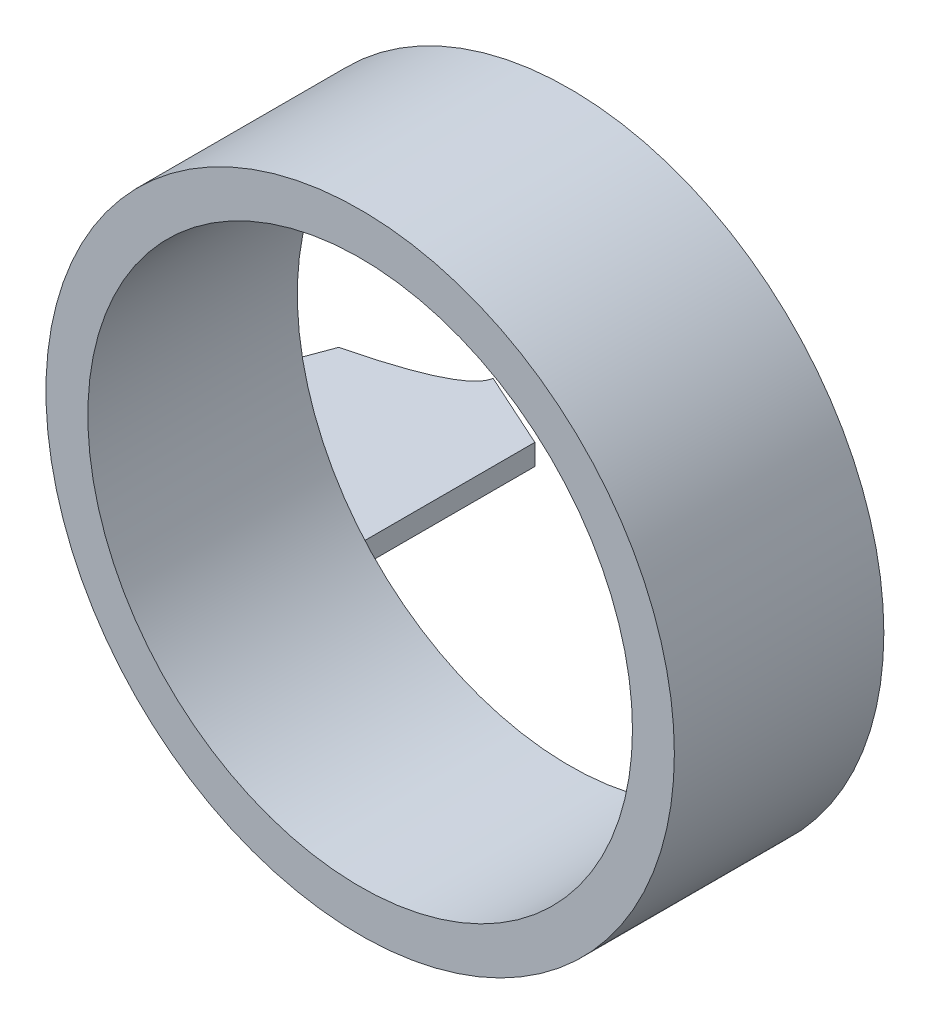
ISO-10303-21;
HEADER;
FILE_DESCRIPTION(('STEP AP214'),'2;1');
FILE_NAME('part.step','',(''),(''),'','','');
FILE_SCHEMA(('AUTOMOTIVE_DESIGN { 1 0 10303 214 1 1 1 1 }'));
ENDSEC;
DATA;
#1=APPLICATION_CONTEXT('core data for automotive mechanical design processes');
#2=APPLICATION_PROTOCOL_DEFINITION('international standard','automotive_design',2000,#1);
#3=PRODUCT_CONTEXT('',#1,'mechanical');
#4=PRODUCT('Part','Part','',(#3));
#5=PRODUCT_RELATED_PRODUCT_CATEGORY('part','',(#4));
#6=PRODUCT_DEFINITION_FORMATION('','',#4);
#7=PRODUCT_DEFINITION_CONTEXT('part definition',#1,'design');
#8=PRODUCT_DEFINITION('design','',#6,#7);
#9=PRODUCT_DEFINITION_SHAPE('','',#8);
#10=(LENGTH_UNIT() NAMED_UNIT(*) SI_UNIT(.MILLI.,.METRE.));
#11=(NAMED_UNIT(*) PLANE_ANGLE_UNIT() SI_UNIT($,.RADIAN.));
#12=(NAMED_UNIT(*) SI_UNIT($,.STERADIAN.) SOLID_ANGLE_UNIT());
#13=UNCERTAINTY_MEASURE_WITH_UNIT(LENGTH_MEASURE(1.E-05),#10,'distance_accuracy_value','');
#14=(GEOMETRIC_REPRESENTATION_CONTEXT(3) GLOBAL_UNCERTAINTY_ASSIGNED_CONTEXT((#13)) GLOBAL_UNIT_ASSIGNED_CONTEXT((#10,
#11,#12)) REPRESENTATION_CONTEXT('',''));
#15=CARTESIAN_POINT('',(0.,0.,0.));
#16=DIRECTION('',(0.,0.,1.));
#17=DIRECTION('',(1.,0.,0.));
#18=AXIS2_PLACEMENT_3D('',#15,#16,#17);
#19=CARTESIAN_POINT('',(-42.4105643599633,-22.,-20.0891984813201));
#20=DIRECTION('',(-0.937499999999993,0.,0.347985272676896));
#21=DIRECTION('',(0.347985272676896,0.,0.937499999999993));
#22=AXIS2_PLACEMENT_3D('',#19,#20,#21);
#23=PLANE('',#22);
#24=DIRECTION('',(0.347985272676896,0.,0.937499999999993));
#25=VECTOR('',#24,1.);
#26=CARTESIAN_POINT('',(-42.4105643599633,-20.,-20.0891984813201));
#27=LINE('',#26,#25);
#28=CARTESIAN_POINT('',(-42.4105643599633,-20.,-20.0891984813201));
#29=VERTEX_POINT('',#28);
#30=CARTESIAN_POINT('',(-39.6266821785482,-20.,-12.5891984813201));
#31=VERTEX_POINT('',#30);
#32=EDGE_CURVE('E193',#29,#31,#27,.T.);
#33=ORIENTED_EDGE('',*,*,#32,.F.);
#34=DIRECTION('',(0.,1.,0.));
#35=VECTOR('',#34,1.);
#36=CARTESIAN_POINT('',(-42.4105643599633,-22.,-20.0891984813201));
#37=LINE('',#36,#35);
#38=CARTESIAN_POINT('',(-42.4105643599633,-22.,-20.0891984813201));
#39=VERTEX_POINT('',#38);
#40=EDGE_CURVE('E12',#39,#29,#37,.T.);
#41=ORIENTED_EDGE('',*,*,#40,.F.);
#42=DIRECTION('',(0.347985272676896,0.,0.937499999999993));
#43=VECTOR('',#42,1.);
#44=CARTESIAN_POINT('',(-42.4105643599633,-22.,-20.0891984813201));
#45=LINE('',#44,#43);
#46=CARTESIAN_POINT('',(-39.6266821785482,-22.,-12.5891984813201));
#47=VERTEX_POINT('',#46);
#48=EDGE_CURVE('E173',#39,#47,#45,.T.);
#49=ORIENTED_EDGE('',*,*,#48,.T.);
#50=DIRECTION('',(0.,1.,0.));
#51=VECTOR('',#50,1.);
#52=CARTESIAN_POINT('',(-39.6266821785482,-22.,-12.5891984813201));
#53=LINE('',#52,#51);
#54=EDGE_CURVE('E54',#47,#31,#53,.T.);
#55=ORIENTED_EDGE('',*,*,#54,.T.);
#56=EDGE_LOOP('',(#33,#41,#49,#55));
#57=FACE_BOUND('',#56,.T.);
#58=ADVANCED_FACE('F51',(#57),#23,.T.);
#59=CARTESIAN_POINT('',(-42.4105643599633,-22.,-20.0891984813201));
#60=DIRECTION('',(0.937499999999994,0.,0.347985272676891));
#61=DIRECTION('',(0.347985272676891,0.,-0.937499999999994));
#62=AXIS2_PLACEMENT_3D('',#59,#60,#61);
#63=PLANE('',#62);
#64=DIRECTION('',(0.347985272676891,0.,-0.937499999999994));
#65=VECTOR('',#64,1.);
#66=CARTESIAN_POINT('',(-42.4105643599633,-20.,-20.0891984813201));
#67=LINE('',#66,#65);
#68=CARTESIAN_POINT('',(-39.6266821785482,-20.,-27.5891984813201));
#69=VERTEX_POINT('',#68);
#70=EDGE_CURVE('E93',#29,#69,#67,.T.);
#71=ORIENTED_EDGE('',*,*,#70,.T.);
#72=DIRECTION('',(0.,1.,0.));
#73=VECTOR('',#72,1.);
#74=CARTESIAN_POINT('',(-39.6266821785482,-22.,-27.5891984813201));
#75=LINE('',#74,#73);
#76=CARTESIAN_POINT('',(-39.6266821785482,-22.,-27.5891984813201));
#77=VERTEX_POINT('',#76);
#78=EDGE_CURVE('E60',#77,#69,#75,.T.);
#79=ORIENTED_EDGE('',*,*,#78,.F.);
#80=DIRECTION('',(0.347985272676891,0.,-0.937499999999994));
#81=VECTOR('',#80,1.);
#82=CARTESIAN_POINT('',(-42.4105643599633,-22.,-20.0891984813201));
#83=LINE('',#82,#81);
#84=EDGE_CURVE('E122',#39,#77,#83,.T.);
#85=ORIENTED_EDGE('',*,*,#84,.F.);
#86=ORIENTED_EDGE('',*,*,#40,.T.);
#87=EDGE_LOOP('',(#71,#79,#85,#86));
#88=FACE_BOUND('',#87,.T.);
#89=ADVANCED_FACE('F154',(#88),#63,.F.);
#90=CARTESIAN_POINT('',(-39.6266821785482,-22.,-27.5891984813201));
#91=CARTESIAN_POINT('',(-30.0547768414409,-22.,-29.9305599536884));
#92=CARTESIAN_POINT('',(-29.6980060097218,-22.,-32.3896824157399));
#93=B_SPLINE_CURVE_WITH_KNOTS('',2,(#90,#91,#92),.UNSPECIFIED.,.F.,.F.,(3,3),(0.,1.),.UNSPECIFIED.);
#94=DIRECTION('',(0.,1.,0.));
#95=VECTOR('',#94,1.);
#96=SURFACE_OF_LINEAR_EXTRUSION('',#93,#95);
#97=CARTESIAN_POINT('',(-39.6266821785482,-20.,-27.5891984813201));
#98=CARTESIAN_POINT('',(-30.0547768414409,-20.,-29.9305599536884));
#99=CARTESIAN_POINT('',(-29.6980060097218,-20.,-32.3896824157399));
#100=B_SPLINE_CURVE_WITH_KNOTS('',2,(#97,#98,#99),.UNSPECIFIED.,.F.,.F.,(3,3),(0.,1.),.UNSPECIFIED.);
#101=CARTESIAN_POINT('',(-29.6980060097218,-20.,-32.3896824157399));
#102=VERTEX_POINT('',#101);
#103=EDGE_CURVE('E129',#69,#102,#100,.T.);
#104=ORIENTED_EDGE('',*,*,#103,.T.);
#105=DIRECTION('',(0.,1.,0.));
#106=VECTOR('',#105,1.);
#107=CARTESIAN_POINT('',(-29.6980060097218,-22.,-32.3896824157399));
#108=LINE('',#107,#106);
#109=CARTESIAN_POINT('',(-29.6980060097218,-22.,-32.3896824157399));
#110=VERTEX_POINT('',#109);
#111=EDGE_CURVE('E126',#110,#102,#108,.T.);
#112=ORIENTED_EDGE('',*,*,#111,.F.);
#113=EDGE_CURVE('E114',#77,#110,#93,.T.);
#114=ORIENTED_EDGE('',*,*,#113,.F.);
#115=ORIENTED_EDGE('',*,*,#78,.T.);
#116=EDGE_LOOP('',(#104,#112,#114,#115));
#117=FACE_BOUND('',#116,.T.);
#118=ADVANCED_FACE('F127',(#117),#96,.F.);
#119=CARTESIAN_POINT('',(-29.6980060097218,-22.,-32.3896824157399));
#120=DIRECTION('',(-0.412560491802471,0.,0.910930206219831));
#121=DIRECTION('',(0.910930206219831,0.,0.412560491802471));
#122=AXIS2_PLACEMENT_3D('',#119,#120,#121);
#123=PLANE('',#122);
#124=DIRECTION('',(0.910930206219831,0.,0.412560491802471));
#125=VECTOR('',#124,1.);
#126=CARTESIAN_POINT('',(-29.6980060097218,-20.,-32.3896824157399));
#127=LINE('',#126,#125);
#128=CARTESIAN_POINT('',(-22.4105643599632,-20.,-29.0891984813201));
#129=VERTEX_POINT('',#128);
#130=EDGE_CURVE('E202',#102,#129,#127,.T.);
#131=ORIENTED_EDGE('',*,*,#130,.T.);
#132=DIRECTION('',(0.,1.,0.));
#133=VECTOR('',#132,1.);
#134=CARTESIAN_POINT('',(-22.4105643599632,-22.,-29.0891984813201));
#135=LINE('',#134,#133);
#136=CARTESIAN_POINT('',(-22.4105643599632,-22.,-29.0891984813201));
#137=VERTEX_POINT('',#136);
#138=EDGE_CURVE('E133',#137,#129,#135,.T.);
#139=ORIENTED_EDGE('',*,*,#138,.F.);
#140=DIRECTION('',(0.910930206219831,0.,0.412560491802471));
#141=VECTOR('',#140,1.);
#142=CARTESIAN_POINT('',(-29.6980060097218,-22.,-32.3896824157399));
#143=LINE('',#142,#141);
#144=EDGE_CURVE('E120',#110,#137,#143,.T.);
#145=ORIENTED_EDGE('',*,*,#144,.F.);
#146=ORIENTED_EDGE('',*,*,#111,.T.);
#147=EDGE_LOOP('',(#131,#139,#145,#146));
#148=FACE_BOUND('',#147,.T.);
#149=ADVANCED_FACE('F135',(#148),#123,.F.);
#150=CARTESIAN_POINT('',(-22.4105643599632,-22.,-11.0891984813201));
#151=DIRECTION('',(1.,0.,0.));
#152=DIRECTION('',(0.,0.,-1.));
#153=AXIS2_PLACEMENT_3D('',#150,#151,#152);
#154=PLANE('',#153);
#155=DIRECTION('',(0.,0.,-1.));
#156=VECTOR('',#155,1.);
#157=CARTESIAN_POINT('',(-22.4105643599632,-20.,-11.0891984813201));
#158=LINE('',#157,#156);
#159=CARTESIAN_POINT('',(-22.4105643599632,-20.,-11.0891984813201));
#160=VERTEX_POINT('',#159);
#161=EDGE_CURVE('E190',#160,#129,#158,.T.);
#162=ORIENTED_EDGE('',*,*,#161,.F.);
#163=DIRECTION('',(0.,1.,0.));
#164=VECTOR('',#163,1.);
#165=CARTESIAN_POINT('',(-22.4105643599632,-22.,-11.0891984813201));
#166=LINE('',#165,#164);
#167=CARTESIAN_POINT('',(-22.4105643599632,-22.,-11.0891984813201));
#168=VERTEX_POINT('',#167);
#169=EDGE_CURVE('E180',#168,#160,#166,.T.);
#170=ORIENTED_EDGE('',*,*,#169,.F.);
#171=DIRECTION('',(0.,0.,-1.));
#172=VECTOR('',#171,1.);
#173=CARTESIAN_POINT('',(-22.4105643599632,-22.,-11.0891984813201));
#174=LINE('',#173,#172);
#175=EDGE_CURVE('E137',#168,#137,#174,.T.);
#176=ORIENTED_EDGE('',*,*,#175,.T.);
#177=ORIENTED_EDGE('',*,*,#138,.T.);
#178=EDGE_LOOP('',(#162,#170,#176,#177));
#179=FACE_BOUND('',#178,.T.);
#180=ADVANCED_FACE('F158',(#179),#154,.T.);
#181=CARTESIAN_POINT('',(-29.6980060097218,-22.,-7.78871454690036));
#182=DIRECTION('',(0.412560491802472,0.,0.91093020621983));
#183=DIRECTION('',(0.91093020621983,0.,-0.412560491802472));
#184=AXIS2_PLACEMENT_3D('',#181,#182,#183);
#185=PLANE('',#184);
#186=DIRECTION('',(0.91093020621983,0.,-0.412560491802472));
#187=VECTOR('',#186,1.);
#188=CARTESIAN_POINT('',(-29.6980060097218,-20.,-7.78871454690036));
#189=LINE('',#188,#187);
#190=CARTESIAN_POINT('',(-29.6980060097218,-20.,-7.78871454690036));
#191=VERTEX_POINT('',#190);
#192=EDGE_CURVE('E187',#191,#160,#189,.T.);
#193=ORIENTED_EDGE('',*,*,#192,.F.);
#194=DIRECTION('',(0.,1.,0.));
#195=VECTOR('',#194,1.);
#196=CARTESIAN_POINT('',(-29.6980060097218,-22.,-7.78871454690036));
#197=LINE('',#196,#195);
#198=CARTESIAN_POINT('',(-29.6980060097218,-22.,-7.78871454690036));
#199=VERTEX_POINT('',#198);
#200=EDGE_CURVE('E182',#199,#191,#197,.T.);
#201=ORIENTED_EDGE('',*,*,#200,.F.);
#202=DIRECTION('',(0.91093020621983,0.,-0.412560491802472));
#203=VECTOR('',#202,1.);
#204=CARTESIAN_POINT('',(-29.6980060097218,-22.,-7.78871454690036));
#205=LINE('',#204,#203);
#206=EDGE_CURVE('E139',#199,#168,#205,.T.);
#207=ORIENTED_EDGE('',*,*,#206,.T.);
#208=ORIENTED_EDGE('',*,*,#169,.T.);
#209=EDGE_LOOP('',(#193,#201,#207,#208));
#210=FACE_BOUND('',#209,.T.);
#211=ADVANCED_FACE('F161',(#210),#185,.T.);
#212=CARTESIAN_POINT('',(-39.6266821785482,-22.,-12.5891984813201));
#213=CARTESIAN_POINT('',(-30.0547768414409,-22.,-10.2478370089519));
#214=CARTESIAN_POINT('',(-29.6980060097218,-22.,-7.78871454690036));
#215=B_SPLINE_CURVE_WITH_KNOTS('',2,(#212,#213,#214),.UNSPECIFIED.,.F.,.F.,(3,3),(0.,1.),.UNSPECIFIED.);
#216=DIRECTION('',(0.,1.,0.));
#217=VECTOR('',#216,1.);
#218=SURFACE_OF_LINEAR_EXTRUSION('',#215,#217);
#219=CARTESIAN_POINT('',(-39.6266821785482,-20.,-12.5891984813201));
#220=CARTESIAN_POINT('',(-30.0547768414409,-20.,-10.2478370089519));
#221=CARTESIAN_POINT('',(-29.6980060097218,-20.,-7.78871454690036));
#222=B_SPLINE_CURVE_WITH_KNOTS('',2,(#219,#220,#221),.UNSPECIFIED.,.F.,.F.,(3,3),(0.,1.),.UNSPECIFIED.);
#223=EDGE_CURVE('E184',#31,#191,#222,.T.);
#224=ORIENTED_EDGE('',*,*,#223,.F.);
#225=ORIENTED_EDGE('',*,*,#54,.F.);
#226=EDGE_CURVE('E168',#47,#199,#215,.T.);
#227=ORIENTED_EDGE('',*,*,#226,.T.);
#228=ORIENTED_EDGE('',*,*,#200,.T.);
#229=EDGE_LOOP('',(#224,#225,#227,#228));
#230=FACE_BOUND('',#229,.T.);
#231=ADVANCED_FACE('F164',(#230),#218,.T.);
#232=CARTESIAN_POINT('',(-32.3585604677879,-22.,-10.2183967615311));
#233=DIRECTION('',(0.,1.,0.));
#234=DIRECTION('',(0.,0.,1.));
#235=AXIS2_PLACEMENT_3D('',#232,#233,#234);
#236=PLANE('',#235);
#237=ORIENTED_EDGE('',*,*,#48,.F.);
#238=ORIENTED_EDGE('',*,*,#84,.T.);
#239=ORIENTED_EDGE('',*,*,#113,.T.);
#240=ORIENTED_EDGE('',*,*,#144,.T.);
#241=ORIENTED_EDGE('',*,*,#175,.F.);
#242=ORIENTED_EDGE('',*,*,#206,.F.);
#243=ORIENTED_EDGE('',*,*,#226,.F.);
#244=EDGE_LOOP('',(#237,#238,#239,#240,#241,#242,#243));
#245=FACE_BOUND('',#244,.T.);
#246=ADVANCED_FACE('F117',(#245),#236,.F.);
#247=CARTESIAN_POINT('',(-32.3585604677879,-20.,-10.2183967615311));
#248=DIRECTION('',(0.,1.,0.));
#249=DIRECTION('',(0.,0.,1.));
#250=AXIS2_PLACEMENT_3D('',#247,#248,#249);
#251=PLANE('',#250);
#252=ORIENTED_EDGE('',*,*,#32,.T.);
#253=ORIENTED_EDGE('',*,*,#223,.T.);
#254=ORIENTED_EDGE('',*,*,#192,.T.);
#255=ORIENTED_EDGE('',*,*,#161,.T.);
#256=ORIENTED_EDGE('',*,*,#130,.F.);
#257=ORIENTED_EDGE('',*,*,#103,.F.);
#258=ORIENTED_EDGE('',*,*,#70,.F.);
#259=EDGE_LOOP('',(#252,#253,#254,#255,#256,#257,#258));
#260=FACE_BOUND('',#259,.T.);
#261=ADVANCED_FACE('F192',(#260),#251,.T.);
#262=CLOSED_SHELL('',(#58,#89,#118,#149,#180,#211,#231,#246,#261));
#263=MANIFOLD_SOLID_BREP('B2',#262);
#264=CARTESIAN_POINT('',(0.,0.,-10.));
#265=DIRECTION('',(0.,0.,1.));
#266=DIRECTION('',(1.,0.,0.));
#267=AXIS2_PLACEMENT_3D('',#264,#265,#266);
#268=CYLINDRICAL_SURFACE('',#267,30.);
#269=CARTESIAN_POINT('',(0.,0.,-10.));
#270=DIRECTION('',(0.,0.,1.));
#271=DIRECTION('',(1.,0.,0.));
#272=AXIS2_PLACEMENT_3D('',#269,#270,#271);
#273=CIRCLE('',#272,30.);
#274=CARTESIAN_POINT('',(30.,0.,-10.));
#275=VERTEX_POINT('',#274);
#276=EDGE_CURVE('E50',#275,#275,#273,.T.);
#277=ORIENTED_EDGE('',*,*,#276,.T.);
#278=EDGE_LOOP('',(#277));
#279=FACE_BOUND('',#278,.T.);
#280=CARTESIAN_POINT('',(0.,0.,10.));
#281=DIRECTION('',(0.,0.,1.));
#282=DIRECTION('',(1.,0.,0.));
#283=AXIS2_PLACEMENT_3D('',#280,#281,#282);
#284=CIRCLE('',#283,30.);
#285=CARTESIAN_POINT('',(30.,0.,10.));
#286=VERTEX_POINT('',#285);
#287=EDGE_CURVE('E282',#286,#286,#284,.T.);
#288=ORIENTED_EDGE('',*,*,#287,.F.);
#289=EDGE_LOOP('',(#288));
#290=FACE_BOUND('',#289,.T.);
#291=ADVANCED_FACE('F275',(#279,#290),#268,.T.);
#292=CARTESIAN_POINT('',(0.,0.,-10.));
#293=DIRECTION('',(0.,0.,1.));
#294=DIRECTION('',(1.,0.,0.));
#295=AXIS2_PLACEMENT_3D('',#292,#293,#294);
#296=PLANE('',#295);
#297=CARTESIAN_POINT('',(0.,0.,-10.));
#298=DIRECTION('',(0.,0.,1.));
#299=DIRECTION('',(1.,0.,0.));
#300=AXIS2_PLACEMENT_3D('',#297,#298,#299);
#301=CIRCLE('',#300,26.);
#302=CARTESIAN_POINT('',(26.,0.,-10.));
#303=VERTEX_POINT('',#302);
#304=EDGE_CURVE('E288',#303,#303,#301,.T.);
#305=ORIENTED_EDGE('',*,*,#304,.T.);
#306=EDGE_LOOP('',(#305));
#307=FACE_BOUND('',#306,.T.);
#308=ORIENTED_EDGE('',*,*,#276,.F.);
#309=EDGE_LOOP('',(#308));
#310=FACE_BOUND('',#309,.T.);
#311=ADVANCED_FACE('F305',(#307,#310),#296,.F.);
#312=CARTESIAN_POINT('',(0.,0.,10.));
#313=DIRECTION('',(0.,0.,1.));
#314=DIRECTION('',(1.,0.,0.));
#315=AXIS2_PLACEMENT_3D('',#312,#313,#314);
#316=PLANE('',#315);
#317=CARTESIAN_POINT('',(0.,0.,10.));
#318=DIRECTION('',(0.,0.,1.));
#319=DIRECTION('',(1.,0.,0.));
#320=AXIS2_PLACEMENT_3D('',#317,#318,#319);
#321=CIRCLE('',#320,26.);
#322=CARTESIAN_POINT('',(26.,0.,10.));
#323=VERTEX_POINT('',#322);
#324=EDGE_CURVE('E278',#323,#323,#321,.F.);
#325=ORIENTED_EDGE('',*,*,#324,.T.);
#326=EDGE_LOOP('',(#325));
#327=FACE_BOUND('',#326,.T.);
#328=ORIENTED_EDGE('',*,*,#287,.T.);
#329=EDGE_LOOP('',(#328));
#330=FACE_BOUND('',#329,.T.);
#331=ADVANCED_FACE('F295',(#327,#330),#316,.T.);
#332=CARTESIAN_POINT('',(0.,0.,20.));
#333=DIRECTION('',(0.,0.,-1.));
#334=DIRECTION('',(-1.,0.,0.));
#335=AXIS2_PLACEMENT_3D('',#332,#333,#334);
#336=CYLINDRICAL_SURFACE('',#335,26.);
#337=ORIENTED_EDGE('',*,*,#324,.F.);
#338=EDGE_LOOP('',(#337));
#339=FACE_BOUND('',#338,.T.);
#340=ORIENTED_EDGE('',*,*,#304,.F.);
#341=EDGE_LOOP('',(#340));
#342=FACE_BOUND('',#341,.T.);
#343=ADVANCED_FACE('F298',(#339,#342),#336,.F.);
#344=CLOSED_SHELL('',(#291,#311,#331,#343));
#345=MANIFOLD_SOLID_BREP('B6',#344);
#346=ADVANCED_BREP_SHAPE_REPRESENTATION('',(#18,#263,#345),#14);
#347=SHAPE_DEFINITION_REPRESENTATION(#9,#346);
ENDSEC;
END-ISO-10303-21;
